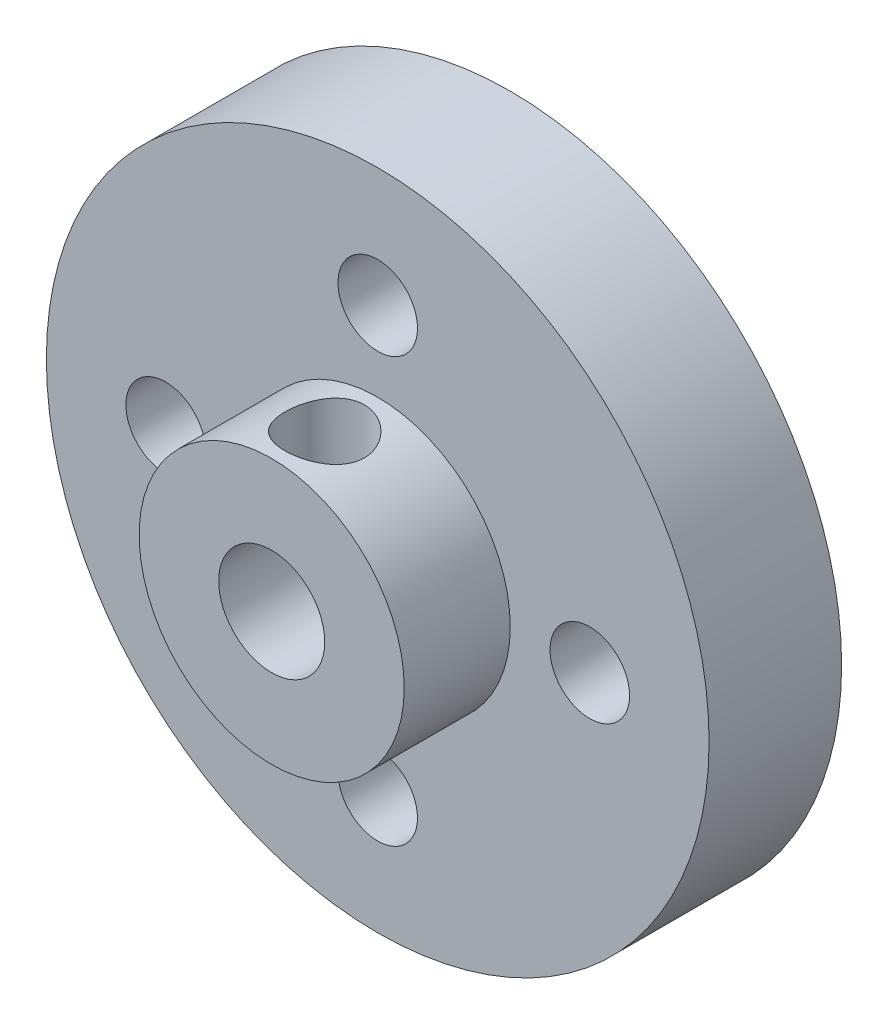
ISO-10303-21;
HEADER;
FILE_DESCRIPTION(('STEP AP214'),'2;1');
FILE_NAME('part.step','',(''),(''),'','','');
FILE_SCHEMA(('AUTOMOTIVE_DESIGN { 1 0 10303 214 1 1 1 1 }'));
ENDSEC;
DATA;
#1=APPLICATION_CONTEXT('core data for automotive mechanical design processes');
#2=APPLICATION_PROTOCOL_DEFINITION('international standard','automotive_design',2000,#1);
#3=PRODUCT_CONTEXT('',#1,'mechanical');
#4=PRODUCT('Part','Part','',(#3));
#5=PRODUCT_RELATED_PRODUCT_CATEGORY('part','',(#4));
#6=PRODUCT_DEFINITION_FORMATION('','',#4);
#7=PRODUCT_DEFINITION_CONTEXT('part definition',#1,'design');
#8=PRODUCT_DEFINITION('design','',#6,#7);
#9=PRODUCT_DEFINITION_SHAPE('','',#8);
#10=(LENGTH_UNIT() NAMED_UNIT(*) SI_UNIT(.MILLI.,.METRE.));
#11=(NAMED_UNIT(*) PLANE_ANGLE_UNIT() SI_UNIT($,.RADIAN.));
#12=(NAMED_UNIT(*) SI_UNIT($,.STERADIAN.) SOLID_ANGLE_UNIT());
#13=UNCERTAINTY_MEASURE_WITH_UNIT(LENGTH_MEASURE(1.E-05),#10,'distance_accuracy_value','');
#14=(GEOMETRIC_REPRESENTATION_CONTEXT(3) GLOBAL_UNCERTAINTY_ASSIGNED_CONTEXT((#13)) GLOBAL_UNIT_ASSIGNED_CONTEXT((#10,
#11,#12)) REPRESENTATION_CONTEXT('',''));
#15=CARTESIAN_POINT('',(0.,0.,0.));
#16=DIRECTION('',(0.,0.,1.));
#17=DIRECTION('',(1.,0.,0.));
#18=AXIS2_PLACEMENT_3D('',#15,#16,#17);
#19=CARTESIAN_POINT('',(0.,0.,9.));
#20=DIRECTION('',(0.,0.,-1.));
#21=DIRECTION('',(-1.,0.,0.));
#22=AXIS2_PLACEMENT_3D('',#19,#20,#21);
#23=CYLINDRICAL_SURFACE('',#22,5.);
#24=CARTESIAN_POINT('',(0.,0.,9.));
#25=DIRECTION('',(0.,0.,1.));
#26=DIRECTION('',(1.,0.,0.));
#27=AXIS2_PLACEMENT_3D('',#24,#25,#26);
#28=CIRCLE('',#27,5.);
#29=CARTESIAN_POINT('',(5.,0.,9.));
#30=VERTEX_POINT('',#29);
#31=EDGE_CURVE('E11',#30,#30,#28,.T.);
#32=ORIENTED_EDGE('',*,*,#31,.F.);
#33=EDGE_LOOP('',(#32));
#34=FACE_BOUND('',#33,.T.);
#35=CARTESIAN_POINT('',(0.,0.,5.));
#36=DIRECTION('',(0.,0.,1.));
#37=DIRECTION('',(1.,0.,0.));
#38=AXIS2_PLACEMENT_3D('',#35,#36,#37);
#39=CIRCLE('',#38,5.);
#40=CARTESIAN_POINT('',(5.,0.,5.));
#41=VERTEX_POINT('',#40);
#42=EDGE_CURVE('E56',#41,#41,#39,.T.);
#43=ORIENTED_EDGE('',*,*,#42,.T.);
#44=EDGE_LOOP('',(#43));
#45=FACE_BOUND('',#44,.T.);
#46=CARTESIAN_POINT('',(0.,5.,5.5));
#47=CARTESIAN_POINT('',(-0.0822886127532999,4.9999992925055,5.50000099748489));
#48=CARTESIAN_POINT('',(-0.164587318351529,4.99794915693954,5.50679386362397));
#49=CARTESIAN_POINT('',(-0.326788125304881,4.98997105593691,5.5337213542221));
#50=CARTESIAN_POINT('',(-0.40668950441142,4.98404193389692,5.55385995802334));
#51=CARTESIAN_POINT('',(-0.561732707754526,4.96895552501836,5.60674601691026));
#52=CARTESIAN_POINT('',(-0.636881364395373,4.95980300250425,5.63947486961894));
#53=CARTESIAN_POINT('',(-0.780624181053131,4.93922109237645,5.71653609305584));
#54=CARTESIAN_POINT('',(-0.849217467469669,4.92779140192067,5.76087000739542));
#55=CARTESIAN_POINT('',(-0.979871797183745,4.90350737192774,5.86122400747267));
#56=CARTESIAN_POINT('',(-1.04171807124434,4.89062383657036,5.91751662588591));
#57=CARTESIAN_POINT('',(-1.15524920923324,4.86505834210442,6.03960922991018));
#58=CARTESIAN_POINT('',(-1.20693236327441,4.85237641724501,6.10541081212496));
#59=CARTESIAN_POINT('',(-1.29980037723708,4.82834113993772,6.24647075303761));
#60=CARTESIAN_POINT('',(-1.34072309022213,4.81702406663875,6.32190846099074));
#61=CARTESIAN_POINT('',(-1.4092139477476,4.79743620394031,6.47898925423029));
#62=CARTESIAN_POINT('',(-1.43678529919973,4.78916468313311,6.56063084392798));
#63=CARTESIAN_POINT('',(-1.47701633682652,4.77690870838434,6.72539026613046));
#64=CARTESIAN_POINT('',(-1.49007196234677,4.77281069324533,6.80840274386394));
#65=CARTESIAN_POINT('',(-1.50213730614672,4.76902789749767,6.97553315621677));
#66=CARTESIAN_POINT('',(-1.50115042761078,4.76934204760571,7.05965081805909));
#67=CARTESIAN_POINT('',(-1.48546977199812,4.77424744067778,7.22338390860849));
#68=CARTESIAN_POINT('',(-1.47127205262685,4.7786838859914,7.30305225036224));
#69=CARTESIAN_POINT('',(-1.43037420427056,4.79108356228624,7.45881978627346));
#70=CARTESIAN_POINT('',(-1.40367284141641,4.79904714132351,7.53491862737434));
#71=CARTESIAN_POINT('',(-1.33816026653682,4.81772733074973,7.68260034966074));
#72=CARTESIAN_POINT('',(-1.29918816934642,4.82848016115952,7.75410708395526));
#73=CARTESIAN_POINT('',(-1.21035222588683,4.85150987000065,7.88973202201019));
#74=CARTESIAN_POINT('',(-1.16048574002588,4.86378711746991,7.95384842941378));
#75=CARTESIAN_POINT('',(-1.04881290765546,4.88911011297937,8.07568619076202));
#76=CARTESIAN_POINT('',(-0.986594907466973,4.90216654310498,8.13302866402967));
#77=CARTESIAN_POINT('',(-0.853263259313967,4.92712244063259,8.23655398406425));
#78=CARTESIAN_POINT('',(-0.782149051860888,4.9390218351841,8.28273612841443));
#79=CARTESIAN_POINT('',(-0.632355038342803,4.9604316006947,8.36285992246473));
#80=CARTESIAN_POINT('',(-0.55362774974795,4.96992543668314,8.39671751624986));
#81=CARTESIAN_POINT('',(-0.39124541560352,4.98533521832222,8.45059959009963));
#82=CARTESIAN_POINT('',(-0.307591751589582,4.99125216186999,8.47062792853249));
#83=CARTESIAN_POINT('',(-0.140952242668332,4.99868364643538,8.4956521778994));
#84=CARTESIAN_POINT('',(-0.0580500976011874,5.0003485041779,8.50116158580161));
#85=CARTESIAN_POINT('',(0.107499605823383,4.9995292324176,8.49843084428792));
#86=CARTESIAN_POINT('',(0.190147196690781,4.99704565677756,8.49019253034856));
#87=CARTESIAN_POINT('',(0.350903605309697,4.98830696987163,8.4606153888885));
#88=CARTESIAN_POINT('',(0.42907277261417,4.98213829799417,8.43957661241913));
#89=CARTESIAN_POINT('',(0.580754638954523,4.96674347841533,8.3853567672218));
#90=CARTESIAN_POINT('',(0.654266777025584,4.95751696321085,8.35217423896214));
#91=CARTESIAN_POINT('',(0.796437189461052,4.93669654351325,8.27374683451887));
#92=CARTESIAN_POINT('',(0.86494382619967,4.92505280829675,8.22824065905203));
#93=CARTESIAN_POINT('',(0.993523307980147,4.90073468764318,8.12677524594719));
#94=CARTESIAN_POINT('',(1.05359403235594,4.8880600443108,8.07081338811233));
#95=CARTESIAN_POINT('',(1.16585744551027,4.86253171869138,7.94761269163066));
#96=CARTESIAN_POINT('',(1.21768481231504,4.84968825033268,7.88003812422826));
#97=CARTESIAN_POINT('',(1.30928995072154,4.82576515238463,7.73687206098647));
#98=CARTESIAN_POINT('',(1.34906803829472,4.81468547654651,7.66128077544179));
#99=CARTESIAN_POINT('',(1.41517347127168,4.79567189615055,7.50446750874531));
#100=CARTESIAN_POINT('',(1.4415634693705,4.78772337843827,7.42327381346341));
#101=CARTESIAN_POINT('',(1.48021730815114,4.77591594362794,7.25731203106852));
#102=CARTESIAN_POINT('',(1.49248598978779,4.772055625083,7.17254517921233));
#103=CARTESIAN_POINT('',(1.50221984485059,4.76899972496087,7.00563848162377));
#104=CARTESIAN_POINT('',(1.5002805530849,4.76961647442754,6.92353634898241));
#105=CARTESIAN_POINT('',(1.48307505444813,4.77499401288294,6.7608858966272));
#106=CARTESIAN_POINT('',(1.46780938124716,4.77975463592551,6.68033751482365));
#107=CARTESIAN_POINT('',(1.42476888804136,4.79275763670386,6.52405460085715));
#108=CARTESIAN_POINT('',(1.39715175507068,4.80095604545965,6.44827271263831));
#109=CARTESIAN_POINT('',(1.33031507121129,4.81990278909136,6.30235756118228));
#110=CARTESIAN_POINT('',(1.29109329962876,4.83065161194312,6.23222538235924));
#111=CARTESIAN_POINT('',(1.20048763805072,4.85397676425833,6.09683688347289));
#112=CARTESIAN_POINT('',(1.14871276092994,4.86660540163798,6.03185123873959));
#113=CARTESIAN_POINT('',(1.03517434629782,4.89201320450026,5.91129750169214));
#114=CARTESIAN_POINT('',(0.973408217134501,4.90479240823905,5.85573186053224));
#115=CARTESIAN_POINT('',(0.839465762183248,4.92950936570649,5.75397658770497));
#116=CARTESIAN_POINT('',(0.767037885790607,4.94141159765674,5.70810855314451));
#117=CARTESIAN_POINT('',(0.615141373983529,4.96260680455813,5.62926483009598));
#118=CARTESIAN_POINT('',(0.535676052998954,4.97190099931067,5.59628311172549));
#119=CARTESIAN_POINT('',(0.380757712655281,4.98602174969301,5.54710472434725));
#120=CARTESIAN_POINT('',(0.305786961954234,4.99122027381068,5.52948832711675));
#121=CARTESIAN_POINT('',(0.153880195230779,4.99820944494492,5.50593647475842));
#122=CARTESIAN_POINT('',(0.0769445098581395,5.0000006615474,5.49999906729518));
#123=CARTESIAN_POINT('',(0.,5.,5.5));
#124=B_SPLINE_CURVE_WITH_KNOTS('',3,(#46,#47,#48,#49,#50,#51,#52,#53,#54,#55,#56,#57,#58,#59,
#60,#61,#62,#63,#64,#65,#66,#67,#68,#69,#70,#71,#72,#73,#74,#75,#76,#77,#78,#79,#80,#81,#82,#83,
#84,#85,#86,#87,#88,#89,#90,#91,#92,#93,#94,#95,#96,#97,#98,#99,#100,#101,#102,#103,#104,#105,
#106,#107,#108,#109,#110,#111,#112,#113,#114,#115,#116,#117,#118,#119,#120,#121,#122,#123),
.UNSPECIFIED.,.T.,.F.,(4,2,2,2,2,2,2,2,2,2,2,2,2,2,2,2,2,2,2,2,2,2,2,2,2,2,2,2,2,2,2,2,2,2,2,2,
2,2,4),(0.,0.24658320361261,0.493239964846,0.739533676300874,0.985860164412702,1.23855602948191,
1.49129437288633,1.74971481004109,2.00807314543224,2.25919689356599,2.51025978319089,
2.75226016697676,2.99428443658001,3.2396242644712,3.48502360158555,3.74067104048167,
3.99633456531072,4.25371046881689,4.51101453528808,4.75908809438545,5.00712853550327,
5.24956746682327,5.49203554593729,5.74011305702908,5.98825282000191,6.24540400322819,
6.50254844252681,6.75847814951252,7.01432009460283,7.25950155466943,7.504673196616,
7.74680040402721,7.98897397553107,8.23996925679931,8.49102974897503,8.74942996156671,
9.00770911595235,9.2383169193046,9.46888616948875),.UNSPECIFIED.);
#125=CARTESIAN_POINT('',(0.,5.,5.5));
#126=VERTEX_POINT('',#125);
#127=EDGE_CURVE('E70',#126,#126,#124,.T.);
#128=ORIENTED_EDGE('',*,*,#127,.F.);
#129=EDGE_LOOP('',(#128));
#130=FACE_BOUND('',#129,.T.);
#131=ADVANCED_FACE('F43',(#34,#45,#130),#23,.T.);
#132=CARTESIAN_POINT('',(0.,0.,0.));
#133=DIRECTION('',(0.,0.,1.));
#134=DIRECTION('',(1.,0.,0.));
#135=AXIS2_PLACEMENT_3D('',#132,#133,#134);
#136=CYLINDRICAL_SURFACE('',#135,2.);
#137=CARTESIAN_POINT('',(0.,0.,9.));
#138=DIRECTION('',(0.,0.,1.));
#139=DIRECTION('',(1.,0.,0.));
#140=AXIS2_PLACEMENT_3D('',#137,#138,#139);
#141=CIRCLE('',#140,2.);
#142=CARTESIAN_POINT('',(2.,0.,9.));
#143=VERTEX_POINT('',#142);
#144=EDGE_CURVE('E64',#143,#143,#141,.T.);
#145=ORIENTED_EDGE('',*,*,#144,.T.);
#146=EDGE_LOOP('',(#145));
#147=FACE_BOUND('',#146,.T.);
#148=CARTESIAN_POINT('',(0.,0.,5.));
#149=DIRECTION('',(0.,0.,1.));
#150=DIRECTION('',(1.,0.,0.));
#151=AXIS2_PLACEMENT_3D('',#148,#149,#150);
#152=CIRCLE('',#151,2.);
#153=CARTESIAN_POINT('',(2.,0.,5.));
#154=VERTEX_POINT('',#153);
#155=EDGE_CURVE('E61',#154,#154,#152,.T.);
#156=ORIENTED_EDGE('',*,*,#155,.F.);
#157=EDGE_LOOP('',(#156));
#158=FACE_BOUND('',#157,.T.);
#159=CARTESIAN_POINT('',(0.,2.,5.5));
#160=CARTESIAN_POINT('',(0.0732207358411543,1.99999540196395,5.50000479201202));
#161=CARTESIAN_POINT('',(0.146561062021485,1.99593645526274,5.5054050243745));
#162=CARTESIAN_POINT('',(0.290936396286467,1.98006607281083,5.52666706341016));
#163=CARTESIAN_POINT('',(0.361965136229004,1.96823514679854,5.54255517165006));
#164=CARTESIAN_POINT('',(0.499234626631249,1.9379567495606,5.58371290928377));
#165=CARTESIAN_POINT('',(0.565501615403737,1.91954951932009,5.60892551356918));
#166=CARTESIAN_POINT('',(0.692422335520753,1.87750556721694,5.66754234418723));
#167=CARTESIAN_POINT('',(0.753077701796332,1.85387037535483,5.70094417419352));
#168=CARTESIAN_POINT('',(0.873465937590145,1.80049544543983,5.77826301159082));
#169=CARTESIAN_POINT('',(0.932593229272032,1.77039308548439,5.82286732933407));
#170=CARTESIAN_POINT('',(1.04302716767671,1.70767017883378,5.91949583736117));
#171=CARTESIAN_POINT('',(1.09432148272226,1.67504578078609,5.97153148279983));
#172=CARTESIAN_POINT('',(1.19837161436623,1.6027112365199,6.09358295327837));
#173=CARTESIAN_POINT('',(1.24930578421204,1.56290854864639,6.1651036771217));
#174=CARTESIAN_POINT('',(1.33861998176348,1.48711444664135,6.31745101236655));
#175=CARTESIAN_POINT('',(1.37701716983077,1.45111786883675,6.39826469700031));
#176=CARTESIAN_POINT('',(1.42880627811788,1.39977155180179,6.53950283867623));
#177=CARTESIAN_POINT('',(1.44625674456539,1.38157751186733,6.59739069712838));
#178=CARTESIAN_POINT('',(1.47420672564844,1.35171594150685,6.71639273478492));
#179=CARTESIAN_POINT('',(1.48472215355267,1.34003347910832,6.77749917787479));
#180=CARTESIAN_POINT('',(1.49812822141445,1.32503759684553,6.90218258553077));
#181=CARTESIAN_POINT('',(1.50094954854207,1.32180026676597,6.96577680672406));
#182=CARTESIAN_POINT('',(1.49848213241869,1.32459531776068,7.09261491088158));
#183=CARTESIAN_POINT('',(1.49319048157349,1.33063102218113,7.15585866008744));
#184=CARTESIAN_POINT('',(1.47597739291882,1.34967623262519,7.27319134742579));
#185=CARTESIAN_POINT('',(1.46482486380817,1.36187157059871,7.32753637104619));
#186=CARTESIAN_POINT('',(1.43705671120732,1.39114192844939,7.43343887872088));
#187=CARTESIAN_POINT('',(1.42043583681172,1.40822163640769,7.4849936278236));
#188=CARTESIAN_POINT('',(1.37033064172535,1.45741769294306,7.61625638663415));
#189=CARTESIAN_POINT('',(1.3328014849398,1.49225649139233,7.69340041664351));
#190=CARTESIAN_POINT('',(1.24618023314519,1.56533298145196,7.83919652386909));
#191=CARTESIAN_POINT('',(1.19706004255878,1.60357878886109,7.90782733925466));
#192=CARTESIAN_POINT('',(1.08651604102135,1.68051672313145,8.03775339040365));
#193=CARTESIAN_POINT('',(1.02481375526037,1.71919586730239,8.09882060688148));
#194=CARTESIAN_POINT('',(0.89042252170959,1.79248037980972,8.21026364678116));
#195=CARTESIAN_POINT('',(0.817755054293756,1.8270934826376,8.26065992023038));
#196=CARTESIAN_POINT('',(0.677902080454142,1.88279726073643,8.33998079924033));
#197=CARTESIAN_POINT('',(0.612539870185619,1.90520770945008,8.37118459421578));
#198=CARTESIAN_POINT('',(0.476352173202086,1.94372904416948,8.42422488046387));
#199=CARTESIAN_POINT('',(0.405530141063765,1.95984387504352,8.44606723849928));
#200=CARTESIAN_POINT('',(0.259676232483517,1.98445588635989,8.47925336288644));
#201=CARTESIAN_POINT('',(0.184621281405941,1.99290592971749,8.49053217893863));
#202=CARTESIAN_POINT('',(0.0332012397969154,2.00115883659445,8.50154959737171));
#203=CARTESIAN_POINT('',(-0.0431632843727253,2.00096534845408,8.50129306869537));
#204=CARTESIAN_POINT('',(-0.186804217329627,1.99242547175873,8.48988913072681));
#205=CARTESIAN_POINT('',(-0.254222327546135,1.98490086600401,8.47983946311133));
#206=CARTESIAN_POINT('',(-0.386110670609119,1.96351320201588,8.45102621999213));
#207=CARTESIAN_POINT('',(-0.450580272987262,1.94964879507262,8.43226079031059));
#208=CARTESIAN_POINT('',(-0.57741677968977,1.91599830683313,8.3861124694069));
#209=CARTESIAN_POINT('',(-0.63962917253614,1.89602050290193,8.3584488185726));
#210=CARTESIAN_POINT('',(-0.758518527043074,1.85166985411963,8.29582754457441));
#211=CARTESIAN_POINT('',(-0.815194721336404,1.82729640132068,8.26086891236027));
#212=CARTESIAN_POINT('',(-0.931511626319038,1.77119146886499,8.17821675358944));
#213=CARTESIAN_POINT('',(-0.990066762698702,1.73891095025037,8.12937146056255));
#214=CARTESIAN_POINT('',(-1.09871974855854,1.67238952874785,8.02399124741161));
#215=CARTESIAN_POINT('',(-1.14879830469577,1.63814438507395,7.96743930030664));
#216=CARTESIAN_POINT('',(-1.24877541075626,1.56369128291496,7.83585011903882));
#217=CARTESIAN_POINT('',(-1.29683043648705,1.523587185201,7.7593424385077));
#218=CARTESIAN_POINT('',(-1.37923235998283,1.4494059134845,7.59663992202755));
#219=CARTESIAN_POINT('',(-1.41362000515519,1.41531099570969,7.51047487809142));
#220=CARTESIAN_POINT('',(-1.45615734256767,1.37118877808582,7.36458555112552));
#221=CARTESIAN_POINT('',(-1.46931009512996,1.35695811824564,7.30760887359762));
#222=CARTESIAN_POINT('',(-1.48891522181906,1.3354205610301,7.19129295301682));
#223=CARTESIAN_POINT('',(-1.4953825519924,1.32809821220233,7.13195929319775));
#224=CARTESIAN_POINT('',(-1.50115320209064,1.32157601792209,7.01217092018867));
#225=CARTESIAN_POINT('',(-1.50042015325262,1.32241740684975,6.95171205699043));
#226=CARTESIAN_POINT('',(-1.49176883838219,1.33216448543666,6.83194316124784));
#227=CARTESIAN_POINT('',(-1.48384130024584,1.34108058157484,6.77263471210274));
#228=CARTESIAN_POINT('',(-1.45893841819723,1.36817348797773,6.6440854285892));
#229=CARTESIAN_POINT('',(-1.44036567954111,1.38794705950643,6.57550281986722));
#230=CARTESIAN_POINT('',(-1.39469627266118,1.4338296338541,6.44346515116951));
#231=CARTESIAN_POINT('',(-1.3675780729773,1.4599546014693,6.38002355796181));
#232=CARTESIAN_POINT('',(-1.29498918933642,1.52516477328824,6.23747936951367));
#233=CARTESIAN_POINT('',(-1.2464154206597,1.56560203191105,6.16057841724424));
#234=CARTESIAN_POINT('',(-1.13650718465936,1.64713510181273,6.01687395502243));
#235=CARTESIAN_POINT('',(-1.07516134758577,1.68823146954223,5.95007953405515));
#236=CARTESIAN_POINT('',(-0.939627144937889,1.76728988939793,5.82716815771667));
#237=CARTESIAN_POINT('',(-0.865337161562858,1.80522333711072,5.7711436806228));
#238=CARTESIAN_POINT('',(-0.705159098936201,1.87357289668097,5.67277694885465));
#239=CARTESIAN_POINT('',(-0.61929942040179,1.90400691592959,5.63040202542749));
#240=CARTESIAN_POINT('',(-0.46484029035645,1.94636704624048,5.57220057901429));
#241=CARTESIAN_POINT('',(-0.398553614774728,1.96110322499718,5.55223326862382));
#242=CARTESIAN_POINT('',(-0.262841610392756,1.98383739970238,5.52158209738851));
#243=CARTESIAN_POINT('',(-0.193425623834902,1.99185421210894,5.51087230975004));
#244=CARTESIAN_POINT('',(-0.102963309861886,1.99745471706309,5.50339530578565));
#245=CARTESIAN_POINT('',(-0.0824069459941217,1.9984076143208,5.50212372251059));
#246=CARTESIAN_POINT('',(-0.0412368896243776,1.99968095423138,5.50042532676903));
#247=CARTESIAN_POINT('',(-0.0206231884283878,2.00000129507253,5.49999865029263));
#248=CARTESIAN_POINT('',(0.,2.,5.5));
#249=B_SPLINE_CURVE_WITH_KNOTS('',3,(#159,#160,#161,#162,#163,#164,#165,#166,#167,#168,#169,
#170,#171,#172,#173,#174,#175,#176,#177,#178,#179,#180,#181,#182,#183,#184,#185,#186,#187,#188,
#189,#190,#191,#192,#193,#194,#195,#196,#197,#198,#199,#200,#201,#202,#203,#204,#205,#206,#207,
#208,#209,#210,#211,#212,#213,#214,#215,#216,#217,#218,#219,#220,#221,#222,#223,#224,#225,#226,
#227,#228,#229,#230,#231,#232,#233,#234,#235,#236,#237,#238,#239,#240,#241,#242,#243,#244,#245,
#246,#247,#248),.UNSPECIFIED.,.T.,.F.,(4,2,2,2,2,2,2,2,2,2,2,2,2,2,2,2,2,2,2,2,2,2,2,2,2,2,2,2,
2,2,2,2,2,2,2,2,2,2,2,2,2,2,2,2,4),(0.,0.219571786572042,0.439696319423244,0.658496333573381,
0.877232398849293,1.1162243131743,1.35558868405162,1.64360015887451,1.93121574056507,
2.11999518529901,2.3083399319529,2.49837587621257,2.6884799430021,2.85826890162709,
3.0282213760064,3.3044933180591,3.58144192357889,3.8653588393809,4.14872662493691,
4.37526505006389,4.60166129643117,4.82944058166899,5.05712372466614,5.26191187011994,
5.46674360185812,5.6788043948368,5.89089453977541,6.13840382081868,6.38646908985452,
6.68168596015947,6.97601595850113,7.15589161422933,7.33536399114209,7.51574333854741,
7.69635548563855,7.91639670960135,8.13699685139922,8.43412246655769,8.73151372390894,
9.03135449492651,9.33047220273165,9.54195697541631,9.75284752283257,9.81468166878711,
9.87652576630966),.UNSPECIFIED.);
#250=CARTESIAN_POINT('',(0.,2.,5.5));
#251=VERTEX_POINT('',#250);
#252=EDGE_CURVE('E47',#251,#251,#249,.T.);
#253=ORIENTED_EDGE('',*,*,#252,.F.);
#254=EDGE_LOOP('',(#253));
#255=FACE_BOUND('',#254,.T.);
#256=ADVANCED_FACE('F85',(#147,#158,#255),#136,.F.);
#257=CARTESIAN_POINT('',(0.,0.,9.));
#258=DIRECTION('',(0.,0.,1.));
#259=DIRECTION('',(1.,0.,0.));
#260=AXIS2_PLACEMENT_3D('',#257,#258,#259);
#261=PLANE('',#260);
#262=ORIENTED_EDGE('',*,*,#144,.F.);
#263=EDGE_LOOP('',(#262));
#264=FACE_BOUND('',#263,.T.);
#265=ORIENTED_EDGE('',*,*,#31,.T.);
#266=EDGE_LOOP('',(#265));
#267=FACE_BOUND('',#266,.T.);
#268=ADVANCED_FACE('F90',(#264,#267),#261,.T.);
#269=CARTESIAN_POINT('',(0.,0.,5.));
#270=DIRECTION('',(0.,0.,1.));
#271=DIRECTION('',(1.,0.,0.));
#272=AXIS2_PLACEMENT_3D('',#269,#270,#271);
#273=PLANE('',#272);
#274=ORIENTED_EDGE('',*,*,#155,.T.);
#275=EDGE_LOOP('',(#274));
#276=FACE_BOUND('',#275,.T.);
#277=ORIENTED_EDGE('',*,*,#42,.F.);
#278=EDGE_LOOP('',(#277));
#279=FACE_BOUND('',#278,.T.);
#280=ADVANCED_FACE('F83',(#276,#279),#273,.F.);
#281=CARTESIAN_POINT('',(0.,12.5,7.));
#282=DIRECTION('',(0.,-1.,0.));
#283=DIRECTION('',(0.,0.,-1.));
#284=AXIS2_PLACEMENT_3D('',#281,#282,#283);
#285=CYLINDRICAL_SURFACE('',#284,1.5);
#286=ORIENTED_EDGE('',*,*,#252,.T.);
#287=EDGE_LOOP('',(#286));
#288=FACE_BOUND('',#287,.T.);
#289=ORIENTED_EDGE('',*,*,#127,.T.);
#290=EDGE_LOOP('',(#289));
#291=FACE_BOUND('',#290,.T.);
#292=ADVANCED_FACE('F80',(#288,#291),#285,.F.);
#293=CLOSED_SHELL('',(#131,#256,#268,#280,#292));
#294=MANIFOLD_SOLID_BREP('B2',#293);
#295=CARTESIAN_POINT('',(0.,0.,5.));
#296=DIRECTION('',(0.,0.,1.));
#297=DIRECTION('',(1.,0.,0.));
#298=AXIS2_PLACEMENT_3D('',#295,#296,#297);
#299=PLANE('',#298);
#300=CARTESIAN_POINT('',(4.52787916007828E-13,-8.,5.));
#301=DIRECTION('',(0.,0.,1.));
#302=DIRECTION('',(1.,0.,0.));
#303=AXIS2_PLACEMENT_3D('',#300,#301,#302);
#304=CIRCLE('',#303,1.50000000000049);
#305=CARTESIAN_POINT('',(1.50000000000094,-8.,5.));
#306=VERTEX_POINT('',#305);
#307=EDGE_CURVE('E164',#306,#306,#304,.T.);
#308=ORIENTED_EDGE('',*,*,#307,.F.);
#309=EDGE_LOOP('',(#308));
#310=FACE_BOUND('',#309,.T.);
#311=CARTESIAN_POINT('',(0.,8.,5.));
#312=DIRECTION('',(0.,0.,1.));
#313=DIRECTION('',(1.,0.,0.));
#314=AXIS2_PLACEMENT_3D('',#311,#312,#313);
#315=CIRCLE('',#314,1.5);
#316=CARTESIAN_POINT('',(1.5,8.,5.));
#317=VERTEX_POINT('',#316);
#318=EDGE_CURVE('E152',#317,#317,#315,.T.);
#319=ORIENTED_EDGE('',*,*,#318,.F.);
#320=EDGE_LOOP('',(#319));
#321=FACE_BOUND('',#320,.T.);
#322=CARTESIAN_POINT('',(0.,0.,5.));
#323=DIRECTION('',(0.,0.,1.));
#324=DIRECTION('',(1.,0.,0.));
#325=AXIS2_PLACEMENT_3D('',#322,#323,#324);
#326=CIRCLE('',#325,12.5);
#327=CARTESIAN_POINT('',(12.5,0.,5.));
#328=VERTEX_POINT('',#327);
#329=EDGE_CURVE('E42',#328,#328,#326,.T.);
#330=ORIENTED_EDGE('',*,*,#329,.T.);
#331=EDGE_LOOP('',(#330));
#332=FACE_BOUND('',#331,.T.);
#333=CARTESIAN_POINT('',(0.,0.,5.));
#334=DIRECTION('',(0.,0.,1.));
#335=DIRECTION('',(1.,0.,0.));
#336=AXIS2_PLACEMENT_3D('',#333,#334,#335);
#337=CIRCLE('',#336,5.);
#338=CARTESIAN_POINT('',(5.,0.,5.));
#339=VERTEX_POINT('',#338);
#340=EDGE_CURVE('E147',#339,#339,#337,.T.);
#341=ORIENTED_EDGE('',*,*,#340,.F.);
#342=EDGE_LOOP('',(#341));
#343=FACE_BOUND('',#342,.T.);
#344=CARTESIAN_POINT('',(8.00000000000023,2.26393958003914E-13,5.));
#345=DIRECTION('',(0.,0.,1.));
#346=DIRECTION('',(1.,0.,0.));
#347=AXIS2_PLACEMENT_3D('',#344,#345,#346);
#348=CIRCLE('',#347,1.50000000000018);
#349=CARTESIAN_POINT('',(9.5000000000004,2.26393958003914E-13,5.));
#350=VERTEX_POINT('',#349);
#351=EDGE_CURVE('E158',#350,#350,#348,.T.);
#352=ORIENTED_EDGE('',*,*,#351,.F.);
#353=EDGE_LOOP('',(#352));
#354=FACE_BOUND('',#353,.T.);
#355=CARTESIAN_POINT('',(-7.99999999999977,-2.27373675443232E-13,5.));
#356=DIRECTION('',(0.,0.,1.));
#357=DIRECTION('',(1.,0.,0.));
#358=AXIS2_PLACEMENT_3D('',#355,#356,#357);
#359=CIRCLE('',#358,1.50000000000036);
#360=CARTESIAN_POINT('',(-6.49999999999941,-2.27373675443232E-13,5.));
#361=VERTEX_POINT('',#360);
#362=EDGE_CURVE('E170',#361,#361,#359,.T.);
#363=ORIENTED_EDGE('',*,*,#362,.F.);
#364=EDGE_LOOP('',(#363));
#365=FACE_BOUND('',#364,.T.);
#366=ADVANCED_FACE('F136',(#310,#321,#332,#343,#354,#365),#299,.T.);
#367=CARTESIAN_POINT('',(0.,0.,0.));
#368=DIRECTION('',(0.,0.,1.));
#369=DIRECTION('',(1.,0.,0.));
#370=AXIS2_PLACEMENT_3D('',#367,#368,#369);
#371=PLANE('',#370);
#372=CARTESIAN_POINT('',(0.,0.,0.));
#373=DIRECTION('',(0.,0.,1.));
#374=DIRECTION('',(1.,0.,0.));
#375=AXIS2_PLACEMENT_3D('',#372,#373,#374);
#376=CIRCLE('',#375,12.5);
#377=CARTESIAN_POINT('',(12.5,0.,0.));
#378=VERTEX_POINT('',#377);
#379=EDGE_CURVE('E140',#378,#378,#376,.T.);
#380=ORIENTED_EDGE('',*,*,#379,.F.);
#381=EDGE_LOOP('',(#380));
#382=FACE_BOUND('',#381,.T.);
#383=CARTESIAN_POINT('',(0.,0.,0.));
#384=DIRECTION('',(0.,0.,1.));
#385=DIRECTION('',(1.,0.,0.));
#386=AXIS2_PLACEMENT_3D('',#383,#384,#385);
#387=CIRCLE('',#386,5.);
#388=CARTESIAN_POINT('',(5.,0.,0.));
#389=VERTEX_POINT('',#388);
#390=EDGE_CURVE('E149',#389,#389,#387,.T.);
#391=ORIENTED_EDGE('',*,*,#390,.T.);
#392=EDGE_LOOP('',(#391));
#393=FACE_BOUND('',#392,.T.);
#394=CARTESIAN_POINT('',(0.,8.,0.));
#395=DIRECTION('',(0.,0.,1.));
#396=DIRECTION('',(1.,0.,0.));
#397=AXIS2_PLACEMENT_3D('',#394,#395,#396);
#398=CIRCLE('',#397,1.5);
#399=CARTESIAN_POINT('',(1.5,8.,0.));
#400=VERTEX_POINT('',#399);
#401=EDGE_CURVE('E155',#400,#400,#398,.T.);
#402=ORIENTED_EDGE('',*,*,#401,.T.);
#403=EDGE_LOOP('',(#402));
#404=FACE_BOUND('',#403,.T.);
#405=CARTESIAN_POINT('',(8.00000000000023,2.26393958003914E-13,0.));
#406=DIRECTION('',(0.,0.,1.));
#407=DIRECTION('',(1.,0.,0.));
#408=AXIS2_PLACEMENT_3D('',#405,#406,#407);
#409=CIRCLE('',#408,1.50000000000018);
#410=CARTESIAN_POINT('',(9.5000000000004,2.26393958003914E-13,0.));
#411=VERTEX_POINT('',#410);
#412=EDGE_CURVE('E161',#411,#411,#409,.T.);
#413=ORIENTED_EDGE('',*,*,#412,.T.);
#414=EDGE_LOOP('',(#413));
#415=FACE_BOUND('',#414,.T.);
#416=CARTESIAN_POINT('',(4.52787916007828E-13,-8.,0.));
#417=DIRECTION('',(0.,0.,1.));
#418=DIRECTION('',(1.,0.,0.));
#419=AXIS2_PLACEMENT_3D('',#416,#417,#418);
#420=CIRCLE('',#419,1.50000000000049);
#421=CARTESIAN_POINT('',(1.50000000000094,-8.,0.));
#422=VERTEX_POINT('',#421);
#423=EDGE_CURVE('E167',#422,#422,#420,.T.);
#424=ORIENTED_EDGE('',*,*,#423,.T.);
#425=EDGE_LOOP('',(#424));
#426=FACE_BOUND('',#425,.T.);
#427=CARTESIAN_POINT('',(-7.99999999999977,-2.27373675443232E-13,0.));
#428=DIRECTION('',(0.,0.,1.));
#429=DIRECTION('',(1.,0.,0.));
#430=AXIS2_PLACEMENT_3D('',#427,#428,#429);
#431=CIRCLE('',#430,1.50000000000036);
#432=CARTESIAN_POINT('',(-6.49999999999941,-2.27373675443232E-13,0.));
#433=VERTEX_POINT('',#432);
#434=EDGE_CURVE('E173',#433,#433,#431,.T.);
#435=ORIENTED_EDGE('',*,*,#434,.T.);
#436=EDGE_LOOP('',(#435));
#437=FACE_BOUND('',#436,.T.);
#438=ADVANCED_FACE('F183',(#382,#393,#404,#415,#426,#437),#371,.F.);
#439=CARTESIAN_POINT('',(0.,0.,5.));
#440=DIRECTION('',(0.,0.,-1.));
#441=DIRECTION('',(-1.,0.,0.));
#442=AXIS2_PLACEMENT_3D('',#439,#440,#441);
#443=CYLINDRICAL_SURFACE('',#442,12.5);
#444=ORIENTED_EDGE('',*,*,#329,.F.);
#445=EDGE_LOOP('',(#444));
#446=FACE_BOUND('',#445,.T.);
#447=ORIENTED_EDGE('',*,*,#379,.T.);
#448=EDGE_LOOP('',(#447));
#449=FACE_BOUND('',#448,.T.);
#450=ADVANCED_FACE('F138',(#446,#449),#443,.T.);
#451=CARTESIAN_POINT('',(0.,0.,5.));
#452=DIRECTION('',(0.,0.,-1.));
#453=DIRECTION('',(-1.,0.,0.));
#454=AXIS2_PLACEMENT_3D('',#451,#452,#453);
#455=CYLINDRICAL_SURFACE('',#454,5.);
#456=ORIENTED_EDGE('',*,*,#340,.T.);
#457=EDGE_LOOP('',(#456));
#458=FACE_BOUND('',#457,.T.);
#459=ORIENTED_EDGE('',*,*,#390,.F.);
#460=EDGE_LOOP('',(#459));
#461=FACE_BOUND('',#460,.T.);
#462=ADVANCED_FACE('F193',(#458,#461),#455,.F.);
#463=CARTESIAN_POINT('',(0.,8.,5.));
#464=DIRECTION('',(0.,0.,-1.));
#465=DIRECTION('',(-1.,0.,0.));
#466=AXIS2_PLACEMENT_3D('',#463,#464,#465);
#467=CYLINDRICAL_SURFACE('',#466,1.5);
#468=ORIENTED_EDGE('',*,*,#318,.T.);
#469=EDGE_LOOP('',(#468));
#470=FACE_BOUND('',#469,.T.);
#471=ORIENTED_EDGE('',*,*,#401,.F.);
#472=EDGE_LOOP('',(#471));
#473=FACE_BOUND('',#472,.T.);
#474=ADVANCED_FACE('F196',(#470,#473),#467,.F.);
#475=CARTESIAN_POINT('',(8.00000000000023,2.26393958003914E-13,5.));
#476=DIRECTION('',(0.,0.,-1.));
#477=DIRECTION('',(-1.,0.,0.));
#478=AXIS2_PLACEMENT_3D('',#475,#476,#477);
#479=CYLINDRICAL_SURFACE('',#478,1.50000000000018);
#480=ORIENTED_EDGE('',*,*,#351,.T.);
#481=EDGE_LOOP('',(#480));
#482=FACE_BOUND('',#481,.T.);
#483=ORIENTED_EDGE('',*,*,#412,.F.);
#484=EDGE_LOOP('',(#483));
#485=FACE_BOUND('',#484,.T.);
#486=ADVANCED_FACE('F200',(#482,#485),#479,.F.);
#487=CARTESIAN_POINT('',(4.52787916007828E-13,-8.,5.));
#488=DIRECTION('',(0.,0.,-1.));
#489=DIRECTION('',(-1.,0.,0.));
#490=AXIS2_PLACEMENT_3D('',#487,#488,#489);
#491=CYLINDRICAL_SURFACE('',#490,1.50000000000049);
#492=ORIENTED_EDGE('',*,*,#307,.T.);
#493=EDGE_LOOP('',(#492));
#494=FACE_BOUND('',#493,.T.);
#495=ORIENTED_EDGE('',*,*,#423,.F.);
#496=EDGE_LOOP('',(#495));
#497=FACE_BOUND('',#496,.T.);
#498=ADVANCED_FACE('F204',(#494,#497),#491,.F.);
#499=CARTESIAN_POINT('',(-7.99999999999977,-2.27373675443232E-13,5.));
#500=DIRECTION('',(0.,0.,-1.));
#501=DIRECTION('',(-1.,0.,0.));
#502=AXIS2_PLACEMENT_3D('',#499,#500,#501);
#503=CYLINDRICAL_SURFACE('',#502,1.50000000000036);
#504=ORIENTED_EDGE('',*,*,#362,.T.);
#505=EDGE_LOOP('',(#504));
#506=FACE_BOUND('',#505,.T.);
#507=ORIENTED_EDGE('',*,*,#434,.F.);
#508=EDGE_LOOP('',(#507));
#509=FACE_BOUND('',#508,.T.);
#510=ADVANCED_FACE('F179',(#506,#509),#503,.F.);
#511=CLOSED_SHELL('',(#366,#438,#450,#462,#474,#486,#498,#510));
#512=MANIFOLD_SOLID_BREP('B6',#511);
#513=ADVANCED_BREP_SHAPE_REPRESENTATION('',(#18,#294,#512),#14);
#514=SHAPE_DEFINITION_REPRESENTATION(#9,#513);
ENDSEC;
END-ISO-10303-21;
